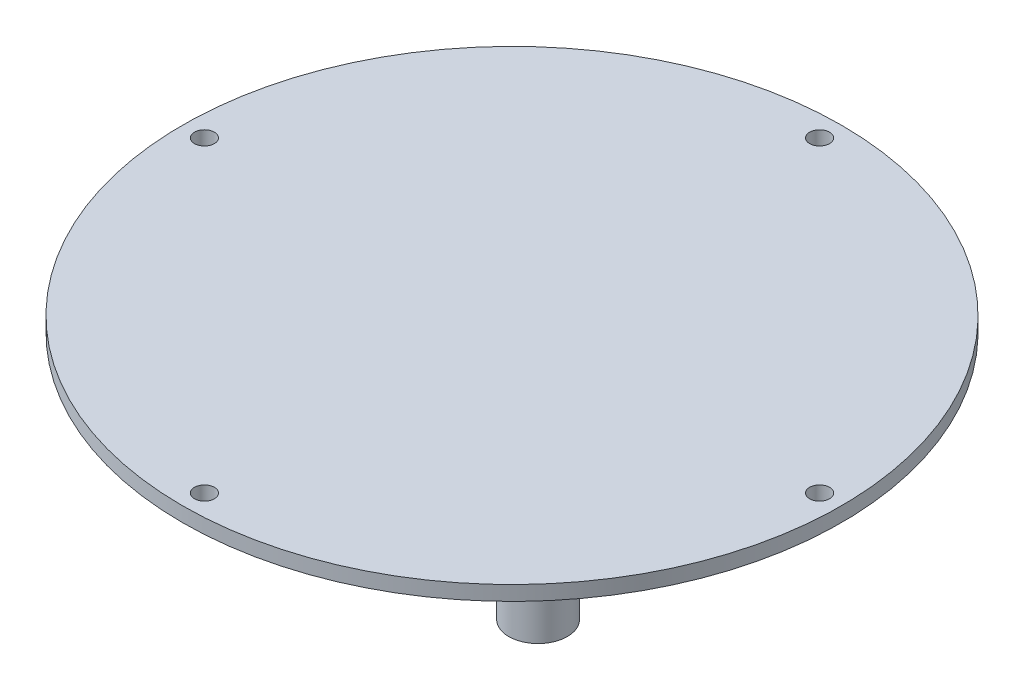
ISO-10303-21;
HEADER;
FILE_DESCRIPTION(('STEP AP214'),'2;1');
FILE_NAME('part.step','',(''),(''),'','','');
FILE_SCHEMA(('AUTOMOTIVE_DESIGN { 1 0 10303 214 1 1 1 1 }'));
ENDSEC;
DATA;
#1=APPLICATION_CONTEXT('core data for automotive mechanical design processes');
#2=APPLICATION_PROTOCOL_DEFINITION('international standard','automotive_design',2000,#1);
#3=PRODUCT_CONTEXT('',#1,'mechanical');
#4=PRODUCT('Part','Part','',(#3));
#5=PRODUCT_RELATED_PRODUCT_CATEGORY('part','',(#4));
#6=PRODUCT_DEFINITION_FORMATION('','',#4);
#7=PRODUCT_DEFINITION_CONTEXT('part definition',#1,'design');
#8=PRODUCT_DEFINITION('design','',#6,#7);
#9=PRODUCT_DEFINITION_SHAPE('','',#8);
#10=(LENGTH_UNIT() NAMED_UNIT(*) SI_UNIT(.MILLI.,.METRE.));
#11=(NAMED_UNIT(*) PLANE_ANGLE_UNIT() SI_UNIT($,.RADIAN.));
#12=(NAMED_UNIT(*) SI_UNIT($,.STERADIAN.) SOLID_ANGLE_UNIT());
#13=UNCERTAINTY_MEASURE_WITH_UNIT(LENGTH_MEASURE(1.E-05),#10,'distance_accuracy_value','');
#14=(GEOMETRIC_REPRESENTATION_CONTEXT(3) GLOBAL_UNCERTAINTY_ASSIGNED_CONTEXT((#13)) GLOBAL_UNIT_ASSIGNED_CONTEXT((#10,
#11,#12)) REPRESENTATION_CONTEXT('',''));
#15=CARTESIAN_POINT('',(0.,0.,0.));
#16=DIRECTION('',(0.,0.,1.));
#17=DIRECTION('',(1.,0.,0.));
#18=AXIS2_PLACEMENT_3D('',#15,#16,#17);
#19=CARTESIAN_POINT('',(0.,2.54,0.));
#20=DIRECTION('',(0.,-1.,0.));
#21=DIRECTION('',(0.,0.,-1.));
#22=AXIS2_PLACEMENT_3D('',#19,#20,#21);
#23=CYLINDRICAL_SURFACE('',#22,57.15);
#24=CARTESIAN_POINT('',(0.,2.54,0.));
#25=DIRECTION('',(0.,1.,0.));
#26=DIRECTION('',(0.,0.,1.));
#27=AXIS2_PLACEMENT_3D('',#24,#25,#26);
#28=CIRCLE('',#27,57.15);
#29=CARTESIAN_POINT('',(0.,2.54,57.15));
#30=VERTEX_POINT('',#29);
#31=EDGE_CURVE('E64',#30,#30,#28,.T.);
#32=ORIENTED_EDGE('',*,*,#31,.F.);
#33=EDGE_LOOP('',(#32));
#34=FACE_BOUND('',#33,.T.);
#35=CARTESIAN_POINT('',(0.,0.,0.));
#36=DIRECTION('',(0.,1.,0.));
#37=DIRECTION('',(0.,0.,1.));
#38=AXIS2_PLACEMENT_3D('',#35,#36,#37);
#39=CIRCLE('',#38,57.15);
#40=CARTESIAN_POINT('',(0.,0.,57.15));
#41=VERTEX_POINT('',#40);
#42=EDGE_CURVE('E65',#41,#41,#39,.T.);
#43=ORIENTED_EDGE('',*,*,#42,.T.);
#44=EDGE_LOOP('',(#43));
#45=FACE_BOUND('',#44,.T.);
#46=ADVANCED_FACE('F45',(#34,#45),#23,.T.);
#47=CARTESIAN_POINT('',(0.,2.54,0.));
#48=DIRECTION('',(0.,1.,0.));
#49=DIRECTION('',(0.,0.,1.));
#50=AXIS2_PLACEMENT_3D('',#47,#48,#49);
#51=PLANE('',#50);
#52=CARTESIAN_POINT('',(-5.58706843841678E-13,2.54,-53.34));
#53=DIRECTION('',(0.,1.,0.));
#54=DIRECTION('',(0.,0.,1.));
#55=AXIS2_PLACEMENT_3D('',#52,#53,#54);
#56=CIRCLE('',#55,1.72719999999999);
#57=CARTESIAN_POINT('',(-5.58706843841678E-13,2.54,-51.6128));
#58=VERTEX_POINT('',#57);
#59=EDGE_CURVE('E100',#58,#58,#56,.T.);
#60=ORIENTED_EDGE('',*,*,#59,.F.);
#61=EDGE_LOOP('',(#60));
#62=FACE_BOUND('',#61,.T.);
#63=CARTESIAN_POINT('',(53.34,2.54,0.));
#64=DIRECTION('',(0.,1.,0.));
#65=DIRECTION('',(0.,0.,1.));
#66=AXIS2_PLACEMENT_3D('',#63,#64,#65);
#67=CIRCLE('',#66,1.72719999999998);
#68=CARTESIAN_POINT('',(53.34,2.54,1.72719999999998));
#69=VERTEX_POINT('',#68);
#70=EDGE_CURVE('E94',#69,#69,#67,.T.);
#71=ORIENTED_EDGE('',*,*,#70,.F.);
#72=EDGE_LOOP('',(#71));
#73=FACE_BOUND('',#72,.T.);
#74=CARTESIAN_POINT('',(1.86235614613893E-13,2.54,53.34));
#75=DIRECTION('',(0.,1.,0.));
#76=DIRECTION('',(0.,0.,1.));
#77=AXIS2_PLACEMENT_3D('',#74,#75,#76);
#78=CIRCLE('',#77,1.72719999999999);
#79=CARTESIAN_POINT('',(1.86235614613893E-13,2.54,55.0672));
#80=VERTEX_POINT('',#79);
#81=EDGE_CURVE('E91',#80,#80,#78,.T.);
#82=ORIENTED_EDGE('',*,*,#81,.F.);
#83=EDGE_LOOP('',(#82));
#84=FACE_BOUND('',#83,.T.);
#85=CARTESIAN_POINT('',(-53.34,2.54,0.));
#86=DIRECTION('',(0.,1.,0.));
#87=DIRECTION('',(0.,0.,1.));
#88=AXIS2_PLACEMENT_3D('',#85,#86,#87);
#89=CIRCLE('',#88,1.72719999999998);
#90=CARTESIAN_POINT('',(-53.34,2.54,1.72719999999998));
#91=VERTEX_POINT('',#90);
#92=EDGE_CURVE('E85',#91,#91,#89,.T.);
#93=ORIENTED_EDGE('',*,*,#92,.F.);
#94=EDGE_LOOP('',(#93));
#95=FACE_BOUND('',#94,.T.);
#96=ORIENTED_EDGE('',*,*,#31,.T.);
#97=EDGE_LOOP('',(#96));
#98=FACE_BOUND('',#97,.T.);
#99=ADVANCED_FACE('F107',(#62,#73,#84,#95,#98),#51,.T.);
#100=CARTESIAN_POINT('',(0.,0.,0.));
#101=DIRECTION('',(0.,1.,0.));
#102=DIRECTION('',(0.,0.,1.));
#103=AXIS2_PLACEMENT_3D('',#100,#101,#102);
#104=PLANE('',#103);
#105=CARTESIAN_POINT('',(-5.58706843841678E-13,0.,-53.34));
#106=DIRECTION('',(0.,1.,0.));
#107=DIRECTION('',(0.,0.,1.));
#108=AXIS2_PLACEMENT_3D('',#105,#106,#107);
#109=CIRCLE('',#108,1.72719999999999);
#110=CARTESIAN_POINT('',(-5.58706843841678E-13,0.,-51.6128));
#111=VERTEX_POINT('',#110);
#112=EDGE_CURVE('E97',#111,#111,#109,.T.);
#113=ORIENTED_EDGE('',*,*,#112,.T.);
#114=EDGE_LOOP('',(#113));
#115=FACE_BOUND('',#114,.T.);
#116=CARTESIAN_POINT('',(53.34,0.,0.));
#117=DIRECTION('',(0.,1.,0.));
#118=DIRECTION('',(0.,0.,1.));
#119=AXIS2_PLACEMENT_3D('',#116,#117,#118);
#120=CIRCLE('',#119,1.72719999999999);
#121=CARTESIAN_POINT('',(53.34,0.,1.72719999999999));
#122=VERTEX_POINT('',#121);
#123=EDGE_CURVE('E48',#122,#122,#120,.T.);
#124=ORIENTED_EDGE('',*,*,#123,.T.);
#125=EDGE_LOOP('',(#124));
#126=FACE_BOUND('',#125,.T.);
#127=CARTESIAN_POINT('',(1.86235614613893E-13,0.,53.34));
#128=DIRECTION('',(0.,1.,0.));
#129=DIRECTION('',(0.,0.,1.));
#130=AXIS2_PLACEMENT_3D('',#127,#128,#129);
#131=CIRCLE('',#130,1.72719999999999);
#132=CARTESIAN_POINT('',(1.86235614613893E-13,0.,55.0672));
#133=VERTEX_POINT('',#132);
#134=EDGE_CURVE('E88',#133,#133,#131,.T.);
#135=ORIENTED_EDGE('',*,*,#134,.T.);
#136=EDGE_LOOP('',(#135));
#137=FACE_BOUND('',#136,.T.);
#138=CARTESIAN_POINT('',(-53.34,0.,0.));
#139=DIRECTION('',(0.,1.,0.));
#140=DIRECTION('',(0.,0.,1.));
#141=AXIS2_PLACEMENT_3D('',#138,#139,#140);
#142=CIRCLE('',#141,1.72719999999999);
#143=CARTESIAN_POINT('',(-53.34,0.,1.72719999999999));
#144=VERTEX_POINT('',#143);
#145=EDGE_CURVE('E82',#144,#144,#142,.T.);
#146=ORIENTED_EDGE('',*,*,#145,.T.);
#147=EDGE_LOOP('',(#146));
#148=FACE_BOUND('',#147,.T.);
#149=CARTESIAN_POINT('',(28.1876424665328,0.,-32.7103838586299));
#150=DIRECTION('',(0.,1.,0.));
#151=DIRECTION('',(0.,0.,1.));
#152=AXIS2_PLACEMENT_3D('',#149,#150,#151);
#153=CIRCLE('',#152,5.08);
#154=CARTESIAN_POINT('',(28.1876424665328,0.,-27.6303838586299));
#155=VERTEX_POINT('',#154);
#156=EDGE_CURVE('E10',#155,#155,#153,.F.);
#157=ORIENTED_EDGE('',*,*,#156,.F.);
#158=EDGE_LOOP('',(#157));
#159=FACE_BOUND('',#158,.T.);
#160=CARTESIAN_POINT('',(32.7103838586296,0.,28.1876424665332));
#161=DIRECTION('',(0.,1.,0.));
#162=DIRECTION('',(0.,0.,1.));
#163=AXIS2_PLACEMENT_3D('',#160,#161,#162);
#164=CIRCLE('',#163,5.08);
#165=CARTESIAN_POINT('',(32.7103838586296,0.,33.2676424665332));
#166=VERTEX_POINT('',#165);
#167=EDGE_CURVE('E52',#166,#166,#164,.F.);
#168=ORIENTED_EDGE('',*,*,#167,.F.);
#169=EDGE_LOOP('',(#168));
#170=FACE_BOUND('',#169,.T.);
#171=CARTESIAN_POINT('',(-28.187642466533,0.,32.7103838586297));
#172=DIRECTION('',(0.,1.,0.));
#173=DIRECTION('',(0.,0.,1.));
#174=AXIS2_PLACEMENT_3D('',#171,#172,#173);
#175=CIRCLE('',#174,5.08);
#176=CARTESIAN_POINT('',(-28.187642466533,0.,37.7903838586297));
#177=VERTEX_POINT('',#176);
#178=EDGE_CURVE('E56',#177,#177,#175,.F.);
#179=ORIENTED_EDGE('',*,*,#178,.F.);
#180=EDGE_LOOP('',(#179));
#181=FACE_BOUND('',#180,.T.);
#182=CARTESIAN_POINT('',(-32.7103838586296,0.,-28.1876424665332));
#183=DIRECTION('',(0.,1.,0.));
#184=DIRECTION('',(0.,0.,1.));
#185=AXIS2_PLACEMENT_3D('',#182,#183,#184);
#186=CIRCLE('',#185,5.08);
#187=CARTESIAN_POINT('',(-32.7103838586296,0.,-23.1076424665332));
#188=VERTEX_POINT('',#187);
#189=EDGE_CURVE('E61',#188,#188,#186,.F.);
#190=ORIENTED_EDGE('',*,*,#189,.F.);
#191=EDGE_LOOP('',(#190));
#192=FACE_BOUND('',#191,.T.);
#193=ORIENTED_EDGE('',*,*,#42,.F.);
#194=EDGE_LOOP('',(#193));
#195=FACE_BOUND('',#194,.T.);
#196=ADVANCED_FACE('F110',(#115,#126,#137,#148,#159,#170,#181,#192,#195),#104,.F.);
#197=CARTESIAN_POINT('',(-32.7103838586296,-12.7,-28.1876424665332));
#198=DIRECTION('',(0.,1.,0.));
#199=DIRECTION('',(0.,0.,1.));
#200=AXIS2_PLACEMENT_3D('',#197,#198,#199);
#201=CYLINDRICAL_SURFACE('',#200,5.08);
#202=CARTESIAN_POINT('',(-32.7103838586296,-12.7,-28.1876424665332));
#203=DIRECTION('',(0.,-1.,0.));
#204=DIRECTION('',(0.,0.,-1.));
#205=AXIS2_PLACEMENT_3D('',#202,#203,#204);
#206=CIRCLE('',#205,5.08);
#207=CARTESIAN_POINT('',(-32.7103838586296,-12.7,-33.2676424665332));
#208=VERTEX_POINT('',#207);
#209=EDGE_CURVE('E68',#208,#208,#206,.T.);
#210=ORIENTED_EDGE('',*,*,#209,.F.);
#211=EDGE_LOOP('',(#210));
#212=FACE_BOUND('',#211,.T.);
#213=ORIENTED_EDGE('',*,*,#189,.T.);
#214=EDGE_LOOP('',(#213));
#215=FACE_BOUND('',#214,.T.);
#216=ADVANCED_FACE('F125',(#212,#215),#201,.T.);
#217=CARTESIAN_POINT('',(-32.7103838586296,-12.7,-28.1876424665332));
#218=DIRECTION('',(0.,-1.,0.));
#219=DIRECTION('',(0.,0.,-1.));
#220=AXIS2_PLACEMENT_3D('',#217,#218,#219);
#221=PLANE('',#220);
#222=ORIENTED_EDGE('',*,*,#209,.T.);
#223=EDGE_LOOP('',(#222));
#224=FACE_BOUND('',#223,.T.);
#225=ADVANCED_FACE('F132',(#224),#221,.T.);
#226=CARTESIAN_POINT('',(-28.187642466533,-12.7,32.7103838586297));
#227=DIRECTION('',(0.,1.,0.));
#228=DIRECTION('',(0.,0.,1.));
#229=AXIS2_PLACEMENT_3D('',#226,#227,#228);
#230=CYLINDRICAL_SURFACE('',#229,5.08);
#231=CARTESIAN_POINT('',(-28.187642466533,-12.7,32.7103838586297));
#232=DIRECTION('',(0.,-1.,0.));
#233=DIRECTION('',(-1.,0.,0.));
#234=AXIS2_PLACEMENT_3D('',#231,#232,#233);
#235=CIRCLE('',#234,5.08);
#236=CARTESIAN_POINT('',(-33.2676424665331,-12.7,32.7103838586297));
#237=VERTEX_POINT('',#236);
#238=EDGE_CURVE('E73',#237,#237,#235,.T.);
#239=ORIENTED_EDGE('',*,*,#238,.F.);
#240=EDGE_LOOP('',(#239));
#241=FACE_BOUND('',#240,.T.);
#242=ORIENTED_EDGE('',*,*,#178,.T.);
#243=EDGE_LOOP('',(#242));
#244=FACE_BOUND('',#243,.T.);
#245=ADVANCED_FACE('F139',(#241,#244),#230,.T.);
#246=CARTESIAN_POINT('',(-28.187642466533,-12.7,32.7103838586297));
#247=DIRECTION('',(0.,-1.,0.));
#248=DIRECTION('',(-1.,0.,0.));
#249=AXIS2_PLACEMENT_3D('',#246,#247,#248);
#250=PLANE('',#249);
#251=ORIENTED_EDGE('',*,*,#238,.T.);
#252=EDGE_LOOP('',(#251));
#253=FACE_BOUND('',#252,.T.);
#254=ADVANCED_FACE('F143',(#253),#250,.T.);
#255=CARTESIAN_POINT('',(32.7103838586296,-12.7,28.1876424665332));
#256=DIRECTION('',(0.,1.,0.));
#257=DIRECTION('',(0.,0.,1.));
#258=AXIS2_PLACEMENT_3D('',#255,#256,#257);
#259=CYLINDRICAL_SURFACE('',#258,5.08);
#260=CARTESIAN_POINT('',(32.7103838586296,-12.7,28.1876424665332));
#261=DIRECTION('',(0.,-1.,0.));
#262=DIRECTION('',(0.,0.,1.));
#263=AXIS2_PLACEMENT_3D('',#260,#261,#262);
#264=CIRCLE('',#263,5.08);
#265=CARTESIAN_POINT('',(32.7103838586296,-12.7,33.2676424665332));
#266=VERTEX_POINT('',#265);
#267=EDGE_CURVE('E76',#266,#266,#264,.T.);
#268=ORIENTED_EDGE('',*,*,#267,.F.);
#269=EDGE_LOOP('',(#268));
#270=FACE_BOUND('',#269,.T.);
#271=ORIENTED_EDGE('',*,*,#167,.T.);
#272=EDGE_LOOP('',(#271));
#273=FACE_BOUND('',#272,.T.);
#274=ADVANCED_FACE('F147',(#270,#273),#259,.T.);
#275=CARTESIAN_POINT('',(32.7103838586296,-12.7,28.1876424665332));
#276=DIRECTION('',(0.,-1.,0.));
#277=DIRECTION('',(0.,0.,1.));
#278=AXIS2_PLACEMENT_3D('',#275,#276,#277);
#279=PLANE('',#278);
#280=ORIENTED_EDGE('',*,*,#267,.T.);
#281=EDGE_LOOP('',(#280));
#282=FACE_BOUND('',#281,.T.);
#283=ADVANCED_FACE('F151',(#282),#279,.T.);
#284=CARTESIAN_POINT('',(28.1876424665328,-12.7,-32.7103838586299));
#285=DIRECTION('',(0.,1.,0.));
#286=DIRECTION('',(0.,0.,1.));
#287=AXIS2_PLACEMENT_3D('',#284,#285,#286);
#288=CYLINDRICAL_SURFACE('',#287,5.08);
#289=CARTESIAN_POINT('',(28.1876424665328,-12.7,-32.7103838586299));
#290=DIRECTION('',(0.,-1.,0.));
#291=DIRECTION('',(1.,0.,0.));
#292=AXIS2_PLACEMENT_3D('',#289,#290,#291);
#293=CIRCLE('',#292,5.08);
#294=CARTESIAN_POINT('',(33.2676424665328,-12.7,-32.71038385863));
#295=VERTEX_POINT('',#294);
#296=EDGE_CURVE('E79',#295,#295,#293,.T.);
#297=ORIENTED_EDGE('',*,*,#296,.F.);
#298=EDGE_LOOP('',(#297));
#299=FACE_BOUND('',#298,.T.);
#300=ORIENTED_EDGE('',*,*,#156,.T.);
#301=EDGE_LOOP('',(#300));
#302=FACE_BOUND('',#301,.T.);
#303=ADVANCED_FACE('F155',(#299,#302),#288,.T.);
#304=CARTESIAN_POINT('',(28.1876424665328,-12.7,-32.7103838586299));
#305=DIRECTION('',(0.,-1.,0.));
#306=DIRECTION('',(1.,0.,0.));
#307=AXIS2_PLACEMENT_3D('',#304,#305,#306);
#308=PLANE('',#307);
#309=ORIENTED_EDGE('',*,*,#296,.T.);
#310=EDGE_LOOP('',(#309));
#311=FACE_BOUND('',#310,.T.);
#312=ADVANCED_FACE('F159',(#311),#308,.T.);
#313=CARTESIAN_POINT('',(-53.34,2.54,0.));
#314=DIRECTION('',(0.,1.,0.));
#315=DIRECTION('',(0.,0.,1.));
#316=AXIS2_PLACEMENT_3D('',#313,#314,#315);
#317=CYLINDRICAL_SURFACE('',#316,1.72719999999999);
#318=ORIENTED_EDGE('',*,*,#92,.T.);
#319=EDGE_LOOP('',(#318));
#320=FACE_BOUND('',#319,.T.);
#321=ORIENTED_EDGE('',*,*,#145,.F.);
#322=EDGE_LOOP('',(#321));
#323=FACE_BOUND('',#322,.T.);
#324=ADVANCED_FACE('F163',(#320,#323),#317,.F.);
#325=CARTESIAN_POINT('',(1.86235614613893E-13,2.54,53.34));
#326=DIRECTION('',(0.,1.,0.));
#327=DIRECTION('',(0.,0.,1.));
#328=AXIS2_PLACEMENT_3D('',#325,#326,#327);
#329=CYLINDRICAL_SURFACE('',#328,1.72719999999999);
#330=ORIENTED_EDGE('',*,*,#81,.T.);
#331=EDGE_LOOP('',(#330));
#332=FACE_BOUND('',#331,.T.);
#333=ORIENTED_EDGE('',*,*,#134,.F.);
#334=EDGE_LOOP('',(#333));
#335=FACE_BOUND('',#334,.T.);
#336=ADVANCED_FACE('F167',(#332,#335),#329,.F.);
#337=CARTESIAN_POINT('',(53.34,2.54,0.));
#338=DIRECTION('',(0.,1.,0.));
#339=DIRECTION('',(0.,0.,1.));
#340=AXIS2_PLACEMENT_3D('',#337,#338,#339);
#341=CYLINDRICAL_SURFACE('',#340,1.72719999999999);
#342=ORIENTED_EDGE('',*,*,#70,.T.);
#343=EDGE_LOOP('',(#342));
#344=FACE_BOUND('',#343,.T.);
#345=ORIENTED_EDGE('',*,*,#123,.F.);
#346=EDGE_LOOP('',(#345));
#347=FACE_BOUND('',#346,.T.);
#348=ADVANCED_FACE('F171',(#344,#347),#341,.F.);
#349=CARTESIAN_POINT('',(-5.58706843841678E-13,2.54,-53.34));
#350=DIRECTION('',(0.,1.,0.));
#351=DIRECTION('',(0.,0.,1.));
#352=AXIS2_PLACEMENT_3D('',#349,#350,#351);
#353=CYLINDRICAL_SURFACE('',#352,1.72719999999999);
#354=ORIENTED_EDGE('',*,*,#59,.T.);
#355=EDGE_LOOP('',(#354));
#356=FACE_BOUND('',#355,.T.);
#357=ORIENTED_EDGE('',*,*,#112,.F.);
#358=EDGE_LOOP('',(#357));
#359=FACE_BOUND('',#358,.T.);
#360=ADVANCED_FACE('F104',(#356,#359),#353,.F.);
#361=CLOSED_SHELL('',(#46,#99,#196,#216,#225,#245,#254,#274,#283,#303,#312,#324,#336,#348,#360));
#362=MANIFOLD_SOLID_BREP('B2',#361);
#363=ADVANCED_BREP_SHAPE_REPRESENTATION('',(#18,#362),#14);
#364=SHAPE_DEFINITION_REPRESENTATION(#9,#363);
ENDSEC;
END-ISO-10303-21;
